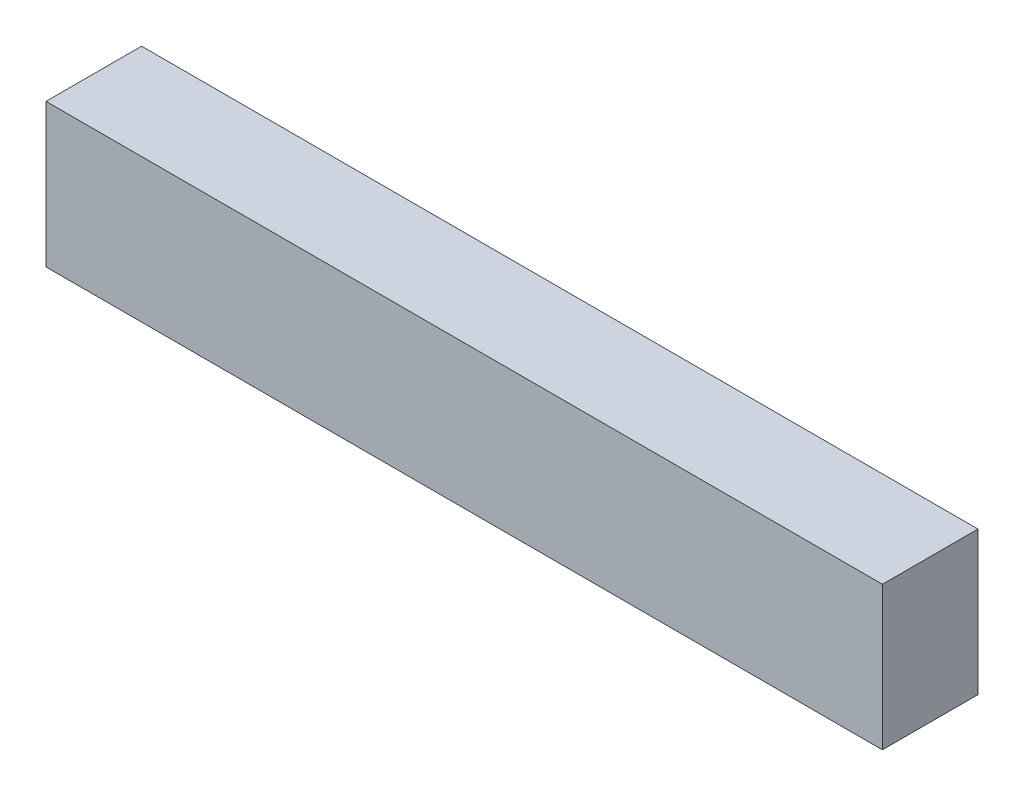
ISO-10303-21;
HEADER;
FILE_DESCRIPTION(('STEP AP214'),'2;1');
FILE_NAME('part.step','',(''),(''),'','','');
FILE_SCHEMA(('AUTOMOTIVE_DESIGN { 1 0 10303 214 1 1 1 1 }'));
ENDSEC;
DATA;
#1=APPLICATION_CONTEXT('core data for automotive mechanical design processes');
#2=APPLICATION_PROTOCOL_DEFINITION('international standard','automotive_design',2000,#1);
#3=PRODUCT_CONTEXT('',#1,'mechanical');
#4=PRODUCT('Part','Part','',(#3));
#5=PRODUCT_RELATED_PRODUCT_CATEGORY('part','',(#4));
#6=PRODUCT_DEFINITION_FORMATION('','',#4);
#7=PRODUCT_DEFINITION_CONTEXT('part definition',#1,'design');
#8=PRODUCT_DEFINITION('design','',#6,#7);
#9=PRODUCT_DEFINITION_SHAPE('','',#8);
#10=(LENGTH_UNIT() NAMED_UNIT(*) SI_UNIT(.MILLI.,.METRE.));
#11=(NAMED_UNIT(*) PLANE_ANGLE_UNIT() SI_UNIT($,.RADIAN.));
#12=(NAMED_UNIT(*) SI_UNIT($,.STERADIAN.) SOLID_ANGLE_UNIT());
#13=UNCERTAINTY_MEASURE_WITH_UNIT(LENGTH_MEASURE(1.E-05),#10,'distance_accuracy_value','');
#14=(GEOMETRIC_REPRESENTATION_CONTEXT(3) GLOBAL_UNCERTAINTY_ASSIGNED_CONTEXT((#13)) GLOBAL_UNIT_ASSIGNED_CONTEXT((#10,
#11,#12)) REPRESENTATION_CONTEXT('',''));
#15=CARTESIAN_POINT('',(0.,0.,0.));
#16=DIRECTION('',(0.,0.,1.));
#17=DIRECTION('',(1.,0.,0.));
#18=AXIS2_PLACEMENT_3D('',#15,#16,#17);
#19=CARTESIAN_POINT('',(-175.,30.,40.));
#20=DIRECTION('',(1.,0.,0.));
#21=DIRECTION('',(0.,0.,-1.));
#22=AXIS2_PLACEMENT_3D('',#19,#20,#21);
#23=PLANE('',#22);
#24=DIRECTION('',(0.,-1.,0.));
#25=VECTOR('',#24,1.);
#26=CARTESIAN_POINT('',(-175.,30.,0.));
#27=LINE('',#26,#25);
#28=CARTESIAN_POINT('',(-175.,30.,0.));
#29=VERTEX_POINT('',#28);
#30=CARTESIAN_POINT('',(-175.,-30.,0.));
#31=VERTEX_POINT('',#30);
#32=EDGE_CURVE('E104',#29,#31,#27,.T.);
#33=ORIENTED_EDGE('',*,*,#32,.T.);
#34=DIRECTION('',(0.,0.,-1.));
#35=VECTOR('',#34,1.);
#36=CARTESIAN_POINT('',(-175.,-30.,40.));
#37=LINE('',#36,#35);
#38=CARTESIAN_POINT('',(-175.,-30.,40.));
#39=VERTEX_POINT('',#38);
#40=EDGE_CURVE('E11',#39,#31,#37,.T.);
#41=ORIENTED_EDGE('',*,*,#40,.F.);
#42=DIRECTION('',(0.,-1.,0.));
#43=VECTOR('',#42,1.);
#44=CARTESIAN_POINT('',(-175.,30.,40.));
#45=LINE('',#44,#43);
#46=CARTESIAN_POINT('',(-175.,30.,40.));
#47=VERTEX_POINT('',#46);
#48=EDGE_CURVE('E92',#47,#39,#45,.T.);
#49=ORIENTED_EDGE('',*,*,#48,.F.);
#50=DIRECTION('',(0.,0.,-1.));
#51=VECTOR('',#50,1.);
#52=CARTESIAN_POINT('',(-175.,30.,40.));
#53=LINE('',#52,#51);
#54=EDGE_CURVE('E100',#47,#29,#53,.T.);
#55=ORIENTED_EDGE('',*,*,#54,.T.);
#56=EDGE_LOOP('',(#33,#41,#49,#55));
#57=FACE_BOUND('',#56,.T.);
#58=ADVANCED_FACE('F41',(#57),#23,.F.);
#59=CARTESIAN_POINT('',(-175.,-30.,40.));
#60=DIRECTION('',(0.,1.,0.));
#61=DIRECTION('',(0.,0.,1.));
#62=AXIS2_PLACEMENT_3D('',#59,#60,#61);
#63=PLANE('',#62);
#64=DIRECTION('',(1.,0.,0.));
#65=VECTOR('',#64,1.);
#66=CARTESIAN_POINT('',(-175.,-30.,0.));
#67=LINE('',#66,#65);
#68=CARTESIAN_POINT('',(175.,-30.,0.));
#69=VERTEX_POINT('',#68);
#70=EDGE_CURVE('E96',#31,#69,#67,.T.);
#71=ORIENTED_EDGE('',*,*,#70,.T.);
#72=DIRECTION('',(0.,0.,-1.));
#73=VECTOR('',#72,1.);
#74=CARTESIAN_POINT('',(175.,-30.,40.));
#75=LINE('',#74,#73);
#76=CARTESIAN_POINT('',(175.,-30.,40.));
#77=VERTEX_POINT('',#76);
#78=EDGE_CURVE('E49',#77,#69,#75,.T.);
#79=ORIENTED_EDGE('',*,*,#78,.F.);
#80=DIRECTION('',(1.,0.,0.));
#81=VECTOR('',#80,1.);
#82=CARTESIAN_POINT('',(-175.,-30.,40.));
#83=LINE('',#82,#81);
#84=EDGE_CURVE('E87',#39,#77,#83,.T.);
#85=ORIENTED_EDGE('',*,*,#84,.F.);
#86=ORIENTED_EDGE('',*,*,#40,.T.);
#87=EDGE_LOOP('',(#71,#79,#85,#86));
#88=FACE_BOUND('',#87,.T.);
#89=ADVANCED_FACE('F95',(#88),#63,.F.);
#90=CARTESIAN_POINT('',(175.,30.,40.));
#91=DIRECTION('',(-1.,0.,0.));
#92=DIRECTION('',(0.,0.,1.));
#93=AXIS2_PLACEMENT_3D('',#90,#91,#92);
#94=PLANE('',#93);
#95=DIRECTION('',(0.,1.,0.));
#96=VECTOR('',#95,1.);
#97=CARTESIAN_POINT('',(175.,30.,0.));
#98=LINE('',#97,#96);
#99=CARTESIAN_POINT('',(175.,30.,0.));
#100=VERTEX_POINT('',#99);
#101=EDGE_CURVE('E74',#69,#100,#98,.T.);
#102=ORIENTED_EDGE('',*,*,#101,.T.);
#103=DIRECTION('',(0.,0.,-1.));
#104=VECTOR('',#103,1.);
#105=CARTESIAN_POINT('',(175.,30.,40.));
#106=LINE('',#105,#104);
#107=CARTESIAN_POINT('',(175.,30.,40.));
#108=VERTEX_POINT('',#107);
#109=EDGE_CURVE('E97',#108,#100,#106,.T.);
#110=ORIENTED_EDGE('',*,*,#109,.F.);
#111=DIRECTION('',(0.,1.,0.));
#112=VECTOR('',#111,1.);
#113=CARTESIAN_POINT('',(175.,30.,40.));
#114=LINE('',#113,#112);
#115=EDGE_CURVE('E90',#77,#108,#114,.T.);
#116=ORIENTED_EDGE('',*,*,#115,.F.);
#117=ORIENTED_EDGE('',*,*,#78,.T.);
#118=EDGE_LOOP('',(#102,#110,#116,#117));
#119=FACE_BOUND('',#118,.T.);
#120=ADVANCED_FACE('F98',(#119),#94,.F.);
#121=CARTESIAN_POINT('',(-175.,30.,40.));
#122=DIRECTION('',(0.,-1.,0.));
#123=DIRECTION('',(0.,0.,-1.));
#124=AXIS2_PLACEMENT_3D('',#121,#122,#123);
#125=PLANE('',#124);
#126=DIRECTION('',(-1.,0.,0.));
#127=VECTOR('',#126,1.);
#128=CARTESIAN_POINT('',(-175.,30.,0.));
#129=LINE('',#128,#127);
#130=EDGE_CURVE('E80',#100,#29,#129,.T.);
#131=ORIENTED_EDGE('',*,*,#130,.T.);
#132=ORIENTED_EDGE('',*,*,#54,.F.);
#133=DIRECTION('',(-1.,0.,0.));
#134=VECTOR('',#133,1.);
#135=CARTESIAN_POINT('',(-175.,30.,40.));
#136=LINE('',#135,#134);
#137=EDGE_CURVE('E57',#108,#47,#136,.T.);
#138=ORIENTED_EDGE('',*,*,#137,.F.);
#139=ORIENTED_EDGE('',*,*,#109,.T.);
#140=EDGE_LOOP('',(#131,#132,#138,#139));
#141=FACE_BOUND('',#140,.T.);
#142=ADVANCED_FACE('F111',(#141),#125,.F.);
#143=CARTESIAN_POINT('',(0.,0.,40.));
#144=DIRECTION('',(0.,0.,1.));
#145=DIRECTION('',(1.,0.,0.));
#146=AXIS2_PLACEMENT_3D('',#143,#144,#145);
#147=PLANE('',#146);
#148=ORIENTED_EDGE('',*,*,#48,.T.);
#149=ORIENTED_EDGE('',*,*,#84,.T.);
#150=ORIENTED_EDGE('',*,*,#115,.T.);
#151=ORIENTED_EDGE('',*,*,#137,.T.);
#152=EDGE_LOOP('',(#148,#149,#150,#151));
#153=FACE_BOUND('',#152,.T.);
#154=ADVANCED_FACE('F88',(#153),#147,.T.);
#155=CARTESIAN_POINT('',(0.,0.,0.));
#156=DIRECTION('',(0.,0.,1.));
#157=DIRECTION('',(1.,0.,0.));
#158=AXIS2_PLACEMENT_3D('',#155,#156,#157);
#159=PLANE('',#158);
#160=ORIENTED_EDGE('',*,*,#32,.F.);
#161=ORIENTED_EDGE('',*,*,#130,.F.);
#162=ORIENTED_EDGE('',*,*,#101,.F.);
#163=ORIENTED_EDGE('',*,*,#70,.F.);
#164=EDGE_LOOP('',(#160,#161,#162,#163));
#165=FACE_BOUND('',#164,.T.);
#166=ADVANCED_FACE('F114',(#165),#159,.F.);
#167=CLOSED_SHELL('',(#58,#89,#120,#142,#154,#166));
#168=MANIFOLD_SOLID_BREP('B2',#167);
#169=ADVANCED_BREP_SHAPE_REPRESENTATION('',(#18,#168),#14);
#170=SHAPE_DEFINITION_REPRESENTATION(#9,#169);
ENDSEC;
END-ISO-10303-21;
